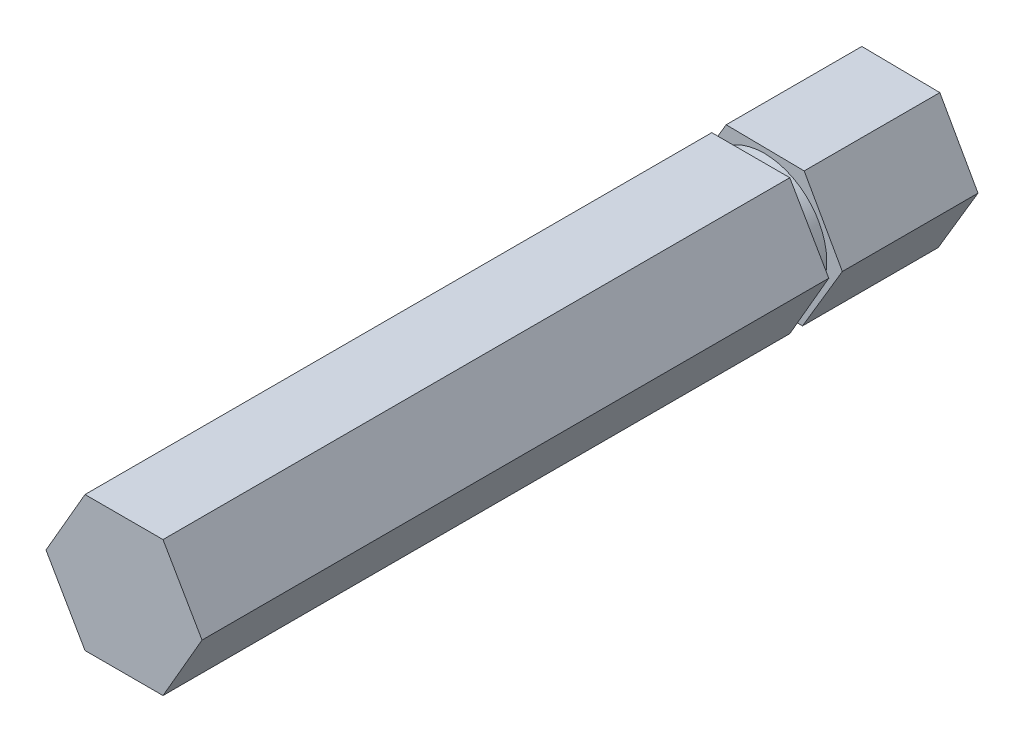
ISO-10303-21;
HEADER;
FILE_DESCRIPTION(('STEP AP214'),'2;1');
FILE_NAME('part.step','',(''),(''),'','','');
FILE_SCHEMA(('AUTOMOTIVE_DESIGN { 1 0 10303 214 1 1 1 1 }'));
ENDSEC;
DATA;
#1=APPLICATION_CONTEXT('core data for automotive mechanical design processes');
#2=APPLICATION_PROTOCOL_DEFINITION('international standard','automotive_design',2000,#1);
#3=PRODUCT_CONTEXT('',#1,'mechanical');
#4=PRODUCT('Part','Part','',(#3));
#5=PRODUCT_RELATED_PRODUCT_CATEGORY('part','',(#4));
#6=PRODUCT_DEFINITION_FORMATION('','',#4);
#7=PRODUCT_DEFINITION_CONTEXT('part definition',#1,'design');
#8=PRODUCT_DEFINITION('design','',#6,#7);
#9=PRODUCT_DEFINITION_SHAPE('','',#8);
#10=(LENGTH_UNIT() NAMED_UNIT(*) SI_UNIT(.MILLI.,.METRE.));
#11=(NAMED_UNIT(*) PLANE_ANGLE_UNIT() SI_UNIT($,.RADIAN.));
#12=(NAMED_UNIT(*) SI_UNIT($,.STERADIAN.) SOLID_ANGLE_UNIT());
#13=UNCERTAINTY_MEASURE_WITH_UNIT(LENGTH_MEASURE(1.E-05),#10,'distance_accuracy_value','');
#14=(GEOMETRIC_REPRESENTATION_CONTEXT(3) GLOBAL_UNCERTAINTY_ASSIGNED_CONTEXT((#13)) GLOBAL_UNIT_ASSIGNED_CONTEXT((#10,
#11,#12)) REPRESENTATION_CONTEXT('',''));
#15=CARTESIAN_POINT('',(0.,0.,0.));
#16=DIRECTION('',(0.,0.,1.));
#17=DIRECTION('',(1.,0.,0.));
#18=AXIS2_PLACEMENT_3D('',#15,#16,#17);
#19=CARTESIAN_POINT('',(3.65125,-6.32415051113586,29.337));
#20=DIRECTION('',(-0.866025403784439,0.5,0.));
#21=DIRECTION('',(-0.5,-0.866025403784439,0.));
#22=AXIS2_PLACEMENT_3D('',#19,#20,#21);
#23=PLANE('',#22);
#24=DIRECTION('',(0.5,0.866025403784439,0.));
#25=VECTOR('',#24,1.);
#26=CARTESIAN_POINT('',(3.65125,-6.32415051113586,-29.337));
#27=LINE('',#26,#25);
#28=CARTESIAN_POINT('',(3.65125,-6.32415051113586,-29.337));
#29=VERTEX_POINT('',#28);
#30=CARTESIAN_POINT('',(7.3025,0.,-29.337));
#31=VERTEX_POINT('',#30);
#32=EDGE_CURVE('E122',#29,#31,#27,.T.);
#33=ORIENTED_EDGE('',*,*,#32,.T.);
#34=DIRECTION('',(0.,0.,-1.));
#35=VECTOR('',#34,1.);
#36=CARTESIAN_POINT('',(7.3025,0.,29.337));
#37=LINE('',#36,#35);
#38=CARTESIAN_POINT('',(7.3025,0.,29.337));
#39=VERTEX_POINT('',#38);
#40=EDGE_CURVE('E41',#39,#31,#37,.T.);
#41=ORIENTED_EDGE('',*,*,#40,.F.);
#42=DIRECTION('',(0.5,0.866025403784439,0.));
#43=VECTOR('',#42,1.);
#44=CARTESIAN_POINT('',(3.65125,-6.32415051113586,29.337));
#45=LINE('',#44,#43);
#46=CARTESIAN_POINT('',(3.65125,-6.32415051113586,29.337));
#47=VERTEX_POINT('',#46);
#48=EDGE_CURVE('E133',#47,#39,#45,.T.);
#49=ORIENTED_EDGE('',*,*,#48,.F.);
#50=DIRECTION('',(0.,0.,-1.));
#51=VECTOR('',#50,1.);
#52=CARTESIAN_POINT('',(3.65125,-6.32415051113586,29.337));
#53=LINE('',#52,#51);
#54=EDGE_CURVE('E118',#47,#29,#53,.T.);
#55=ORIENTED_EDGE('',*,*,#54,.T.);
#56=EDGE_LOOP('',(#33,#41,#49,#55));
#57=FACE_BOUND('',#56,.T.);
#58=ADVANCED_FACE('F33',(#57),#23,.F.);
#59=CARTESIAN_POINT('',(7.3025,0.,29.337));
#60=DIRECTION('',(-0.866025403784439,-0.5,0.));
#61=DIRECTION('',(0.5,-0.866025403784439,0.));
#62=AXIS2_PLACEMENT_3D('',#59,#60,#61);
#63=PLANE('',#62);
#64=DIRECTION('',(-0.5,0.866025403784439,0.));
#65=VECTOR('',#64,1.);
#66=CARTESIAN_POINT('',(7.3025,0.,-29.337));
#67=LINE('',#66,#65);
#68=CARTESIAN_POINT('',(3.65125,6.32415051113586,-29.337));
#69=VERTEX_POINT('',#68);
#70=EDGE_CURVE('E125',#31,#69,#67,.T.);
#71=ORIENTED_EDGE('',*,*,#70,.T.);
#72=DIRECTION('',(0.,0.,-1.));
#73=VECTOR('',#72,1.);
#74=CARTESIAN_POINT('',(3.65125,6.32415051113586,29.337));
#75=LINE('',#74,#73);
#76=CARTESIAN_POINT('',(3.65125,6.32415051113586,29.337));
#77=VERTEX_POINT('',#76);
#78=EDGE_CURVE('E137',#77,#69,#75,.T.);
#79=ORIENTED_EDGE('',*,*,#78,.F.);
#80=DIRECTION('',(-0.5,0.866025403784439,0.));
#81=VECTOR('',#80,1.);
#82=CARTESIAN_POINT('',(7.3025,0.,29.337));
#83=LINE('',#82,#81);
#84=EDGE_CURVE('E88',#39,#77,#83,.T.);
#85=ORIENTED_EDGE('',*,*,#84,.F.);
#86=ORIENTED_EDGE('',*,*,#40,.T.);
#87=EDGE_LOOP('',(#71,#79,#85,#86));
#88=FACE_BOUND('',#87,.T.);
#89=ADVANCED_FACE('F140',(#88),#63,.F.);
#90=CARTESIAN_POINT('',(3.65125,6.32415051113586,29.337));
#91=DIRECTION('',(0.,-1.,0.));
#92=DIRECTION('',(0.,0.,-1.));
#93=AXIS2_PLACEMENT_3D('',#90,#91,#92);
#94=PLANE('',#93);
#95=DIRECTION('',(-1.,0.,0.));
#96=VECTOR('',#95,1.);
#97=CARTESIAN_POINT('',(3.65125,6.32415051113586,-29.337));
#98=LINE('',#97,#96);
#99=CARTESIAN_POINT('',(-3.65125,6.32415051113586,-29.337));
#100=VERTEX_POINT('',#99);
#101=EDGE_CURVE('E128',#69,#100,#98,.T.);
#102=ORIENTED_EDGE('',*,*,#101,.T.);
#103=DIRECTION('',(0.,0.,-1.));
#104=VECTOR('',#103,1.);
#105=CARTESIAN_POINT('',(-3.65125,6.32415051113586,29.337));
#106=LINE('',#105,#104);
#107=CARTESIAN_POINT('',(-3.65125,6.32415051113586,29.337));
#108=VERTEX_POINT('',#107);
#109=EDGE_CURVE('E113',#108,#100,#106,.T.);
#110=ORIENTED_EDGE('',*,*,#109,.F.);
#111=DIRECTION('',(-1.,0.,0.));
#112=VECTOR('',#111,1.);
#113=CARTESIAN_POINT('',(3.65125,6.32415051113586,29.337));
#114=LINE('',#113,#112);
#115=EDGE_CURVE('E104',#77,#108,#114,.T.);
#116=ORIENTED_EDGE('',*,*,#115,.F.);
#117=ORIENTED_EDGE('',*,*,#78,.T.);
#118=EDGE_LOOP('',(#102,#110,#116,#117));
#119=FACE_BOUND('',#118,.T.);
#120=ADVANCED_FACE('F148',(#119),#94,.F.);
#121=CARTESIAN_POINT('',(-3.65125,6.32415051113586,29.337));
#122=DIRECTION('',(0.866025403784439,-0.5,0.));
#123=DIRECTION('',(0.5,0.866025403784439,0.));
#124=AXIS2_PLACEMENT_3D('',#121,#122,#123);
#125=PLANE('',#124);
#126=DIRECTION('',(-0.5,-0.866025403784439,0.));
#127=VECTOR('',#126,1.);
#128=CARTESIAN_POINT('',(-3.65125,6.32415051113586,-29.337));
#129=LINE('',#128,#127);
#130=CARTESIAN_POINT('',(-7.3025,0.,-29.337));
#131=VERTEX_POINT('',#130);
#132=EDGE_CURVE('E112',#100,#131,#129,.T.);
#133=ORIENTED_EDGE('',*,*,#132,.T.);
#134=DIRECTION('',(0.,0.,-1.));
#135=VECTOR('',#134,1.);
#136=CARTESIAN_POINT('',(-7.3025,0.,29.337));
#137=LINE('',#136,#135);
#138=CARTESIAN_POINT('',(-7.3025,0.,29.337));
#139=VERTEX_POINT('',#138);
#140=EDGE_CURVE('E109',#139,#131,#137,.T.);
#141=ORIENTED_EDGE('',*,*,#140,.F.);
#142=DIRECTION('',(-0.5,-0.866025403784439,0.));
#143=VECTOR('',#142,1.);
#144=CARTESIAN_POINT('',(-3.65125,6.32415051113586,29.337));
#145=LINE('',#144,#143);
#146=EDGE_CURVE('E98',#108,#139,#145,.T.);
#147=ORIENTED_EDGE('',*,*,#146,.F.);
#148=ORIENTED_EDGE('',*,*,#109,.T.);
#149=EDGE_LOOP('',(#133,#141,#147,#148));
#150=FACE_BOUND('',#149,.T.);
#151=ADVANCED_FACE('F110',(#150),#125,.F.);
#152=CARTESIAN_POINT('',(-7.3025,0.,29.337));
#153=DIRECTION('',(0.866025403784439,0.5,0.));
#154=DIRECTION('',(-0.5,0.866025403784439,0.));
#155=AXIS2_PLACEMENT_3D('',#152,#153,#154);
#156=PLANE('',#155);
#157=DIRECTION('',(0.5,-0.866025403784439,0.));
#158=VECTOR('',#157,1.);
#159=CARTESIAN_POINT('',(-7.3025,0.,-29.337));
#160=LINE('',#159,#158);
#161=CARTESIAN_POINT('',(-3.65125,-6.32415051113586,-29.337));
#162=VERTEX_POINT('',#161);
#163=EDGE_CURVE('E73',#131,#162,#160,.T.);
#164=ORIENTED_EDGE('',*,*,#163,.T.);
#165=DIRECTION('',(0.,0.,-1.));
#166=VECTOR('',#165,1.);
#167=CARTESIAN_POINT('',(-3.65125,-6.32415051113586,29.337));
#168=LINE('',#167,#166);
#169=CARTESIAN_POINT('',(-3.65125,-6.32415051113586,29.337));
#170=VERTEX_POINT('',#169);
#171=EDGE_CURVE('E114',#170,#162,#168,.T.);
#172=ORIENTED_EDGE('',*,*,#171,.F.);
#173=DIRECTION('',(0.5,-0.866025403784439,0.));
#174=VECTOR('',#173,1.);
#175=CARTESIAN_POINT('',(-7.3025,0.,29.337));
#176=LINE('',#175,#174);
#177=EDGE_CURVE('E102',#139,#170,#176,.T.);
#178=ORIENTED_EDGE('',*,*,#177,.F.);
#179=ORIENTED_EDGE('',*,*,#140,.T.);
#180=EDGE_LOOP('',(#164,#172,#178,#179));
#181=FACE_BOUND('',#180,.T.);
#182=ADVANCED_FACE('F116',(#181),#156,.F.);
#183=CARTESIAN_POINT('',(-3.65125,-6.32415051113586,29.337));
#184=DIRECTION('',(0.,1.,0.));
#185=DIRECTION('',(-1.,0.,0.));
#186=AXIS2_PLACEMENT_3D('',#183,#184,#185);
#187=PLANE('',#186);
#188=DIRECTION('',(1.,0.,0.));
#189=VECTOR('',#188,1.);
#190=CARTESIAN_POINT('',(-3.65125,-6.32415051113586,-29.337));
#191=LINE('',#190,#189);
#192=EDGE_CURVE('E79',#162,#29,#191,.T.);
#193=ORIENTED_EDGE('',*,*,#192,.T.);
#194=ORIENTED_EDGE('',*,*,#54,.F.);
#195=DIRECTION('',(1.,0.,0.));
#196=VECTOR('',#195,1.);
#197=CARTESIAN_POINT('',(-3.65125,-6.32415051113586,29.337));
#198=LINE('',#197,#196);
#199=EDGE_CURVE('E49',#170,#47,#198,.T.);
#200=ORIENTED_EDGE('',*,*,#199,.F.);
#201=ORIENTED_EDGE('',*,*,#171,.T.);
#202=EDGE_LOOP('',(#193,#194,#200,#201));
#203=FACE_BOUND('',#202,.T.);
#204=ADVANCED_FACE('F265',(#203),#187,.F.);
#205=CARTESIAN_POINT('',(0.,0.,29.337));
#206=DIRECTION('',(0.,0.,1.));
#207=DIRECTION('',(1.,0.,0.));
#208=AXIS2_PLACEMENT_3D('',#205,#206,#207);
#209=PLANE('',#208);
#210=ORIENTED_EDGE('',*,*,#48,.T.);
#211=ORIENTED_EDGE('',*,*,#84,.T.);
#212=ORIENTED_EDGE('',*,*,#115,.T.);
#213=ORIENTED_EDGE('',*,*,#146,.T.);
#214=ORIENTED_EDGE('',*,*,#177,.T.);
#215=ORIENTED_EDGE('',*,*,#199,.T.);
#216=EDGE_LOOP('',(#210,#211,#212,#213,#214,#215));
#217=FACE_BOUND('',#216,.T.);
#218=ADVANCED_FACE('F100',(#217),#209,.T.);
#219=CARTESIAN_POINT('',(0.,0.,-29.337));
#220=DIRECTION('',(0.,0.,1.));
#221=DIRECTION('',(1.,0.,0.));
#222=AXIS2_PLACEMENT_3D('',#219,#220,#221);
#223=PLANE('',#222);
#224=CARTESIAN_POINT('',(0.,0.,-29.337));
#225=DIRECTION('',(0.,0.,1.));
#226=DIRECTION('',(1.,0.,0.));
#227=AXIS2_PLACEMENT_3D('',#224,#225,#226);
#228=CIRCLE('',#227,5.842);
#229=CARTESIAN_POINT('',(5.842,0.,-29.337));
#230=VERTEX_POINT('',#229);
#231=EDGE_CURVE('E11',#230,#230,#228,.F.);
#232=ORIENTED_EDGE('',*,*,#231,.F.);
#233=EDGE_LOOP('',(#232));
#234=FACE_BOUND('',#233,.T.);
#235=ORIENTED_EDGE('',*,*,#32,.F.);
#236=ORIENTED_EDGE('',*,*,#192,.F.);
#237=ORIENTED_EDGE('',*,*,#163,.F.);
#238=ORIENTED_EDGE('',*,*,#132,.F.);
#239=ORIENTED_EDGE('',*,*,#101,.F.);
#240=ORIENTED_EDGE('',*,*,#70,.F.);
#241=EDGE_LOOP('',(#235,#236,#237,#238,#239,#240));
#242=FACE_BOUND('',#241,.T.);
#243=ADVANCED_FACE('F145',(#234,#242),#223,.F.);
#244=CARTESIAN_POINT('',(0.,0.,-30.607));
#245=DIRECTION('',(0.,0.,1.));
#246=DIRECTION('',(1.,0.,0.));
#247=AXIS2_PLACEMENT_3D('',#244,#245,#246);
#248=CYLINDRICAL_SURFACE('',#247,5.842);
#249=CARTESIAN_POINT('',(0.,0.,-30.607));
#250=DIRECTION('',(0.,0.,-1.));
#251=DIRECTION('',(-1.,0.,0.));
#252=AXIS2_PLACEMENT_3D('',#249,#250,#251);
#253=CIRCLE('',#252,5.842);
#254=CARTESIAN_POINT('',(-5.842,0.,-30.607));
#255=VERTEX_POINT('',#254);
#256=EDGE_CURVE('E126',#255,#255,#253,.T.);
#257=ORIENTED_EDGE('',*,*,#256,.F.);
#258=EDGE_LOOP('',(#257));
#259=FACE_BOUND('',#258,.T.);
#260=ORIENTED_EDGE('',*,*,#231,.T.);
#261=EDGE_LOOP('',(#260));
#262=FACE_BOUND('',#261,.T.);
#263=ADVANCED_FACE('F270',(#259,#262),#248,.T.);
#264=CARTESIAN_POINT('',(3.5723825570693,-6.36903360926497,-43.307));
#265=DIRECTION('',(0.0124262592501265,0.999922791059914,0.));
#266=DIRECTION('',(-0.999922791059914,0.0124262592501265,0.));
#267=AXIS2_PLACEMENT_3D('',#264,#265,#266);
#268=PLANE('',#267);
#269=DIRECTION('',(-0.999922791059914,0.0124262592501265,0.));
#270=VECTOR('',#269,1.);
#271=CARTESIAN_POINT('',(3.5723825570693,-6.36903360926497,-30.607));
#272=LINE('',#271,#270);
#273=CARTESIAN_POINT('',(3.5723825570693,-6.36903360926497,-30.607));
#274=VERTEX_POINT('',#273);
#275=CARTESIAN_POINT('',(-3.7295536246457,-6.27829085109092,-30.607));
#276=VERTEX_POINT('',#275);
#277=EDGE_CURVE('E189',#274,#276,#272,.T.);
#278=ORIENTED_EDGE('',*,*,#277,.T.);
#279=DIRECTION('',(0.,0.,1.));
#280=VECTOR('',#279,1.);
#281=CARTESIAN_POINT('',(-3.7295536246457,-6.27829085109092,-43.307));
#282=LINE('',#281,#280);
#283=CARTESIAN_POINT('',(-3.7295536246457,-6.27829085109092,-43.307));
#284=VERTEX_POINT('',#283);
#285=EDGE_CURVE('E154',#284,#276,#282,.T.);
#286=ORIENTED_EDGE('',*,*,#285,.F.);
#287=DIRECTION('',(-0.999922791059914,0.0124262592501265,0.));
#288=VECTOR('',#287,1.);
#289=CARTESIAN_POINT('',(3.5723825570693,-6.36903360926497,-43.307));
#290=LINE('',#289,#288);
#291=CARTESIAN_POINT('',(3.5723825570693,-6.36903360926497,-43.307));
#292=VERTEX_POINT('',#291);
#293=EDGE_CURVE('E176',#292,#284,#290,.T.);
#294=ORIENTED_EDGE('',*,*,#293,.F.);
#295=DIRECTION('',(0.,0.,1.));
#296=VECTOR('',#295,1.);
#297=CARTESIAN_POINT('',(3.5723825570693,-6.36903360926497,-43.307));
#298=LINE('',#297,#296);
#299=EDGE_CURVE('E169',#292,#274,#298,.T.);
#300=ORIENTED_EDGE('',*,*,#299,.T.);
#301=EDGE_LOOP('',(#278,#286,#294,#300));
#302=FACE_BOUND('',#301,.T.);
#303=ADVANCED_FACE('F219',(#302),#268,.F.);
#304=CARTESIAN_POINT('',(-3.7295536246457,-6.27829085109092,-43.307));
#305=DIRECTION('',(0.872171668505988,0.489199939345336,0.));
#306=DIRECTION('',(-0.489199939345336,0.872171668505988,0.));
#307=AXIS2_PLACEMENT_3D('',#304,#305,#306);
#308=PLANE('',#307);
#309=DIRECTION('',(-0.489199939345336,0.872171668505988,0.));
#310=VECTOR('',#309,1.);
#311=CARTESIAN_POINT('',(-3.7295536246457,-6.27829085109092,-30.607));
#312=LINE('',#311,#310);
#313=CARTESIAN_POINT('',(-7.30193618171502,0.0907427581740539,-30.607));
#314=VERTEX_POINT('',#313);
#315=EDGE_CURVE('E186',#276,#314,#312,.T.);
#316=ORIENTED_EDGE('',*,*,#315,.T.);
#317=DIRECTION('',(0.,0.,1.));
#318=VECTOR('',#317,1.);
#319=CARTESIAN_POINT('',(-7.30193618171502,0.0907427581740539,-43.307));
#320=LINE('',#319,#318);
#321=CARTESIAN_POINT('',(-7.30193618171502,0.0907427581740539,-43.307));
#322=VERTEX_POINT('',#321);
#323=EDGE_CURVE('E157',#322,#314,#320,.T.);
#324=ORIENTED_EDGE('',*,*,#323,.F.);
#325=DIRECTION('',(-0.489199939345336,0.872171668505988,0.));
#326=VECTOR('',#325,1.);
#327=CARTESIAN_POINT('',(-3.7295536246457,-6.27829085109092,-43.307));
#328=LINE('',#327,#326);
#329=EDGE_CURVE('E203',#284,#322,#328,.T.);
#330=ORIENTED_EDGE('',*,*,#329,.F.);
#331=ORIENTED_EDGE('',*,*,#285,.T.);
#332=EDGE_LOOP('',(#316,#324,#330,#331));
#333=FACE_BOUND('',#332,.T.);
#334=ADVANCED_FACE('F223',(#333),#308,.F.);
#335=CARTESIAN_POINT('',(-7.30193618171502,0.0907427581740539,-43.307));
#336=DIRECTION('',(0.859745409255861,-0.510722851714579,0.));
#337=DIRECTION('',(0.510722851714579,0.859745409255861,0.));
#338=AXIS2_PLACEMENT_3D('',#335,#336,#337);
#339=PLANE('',#338);
#340=DIRECTION('',(0.510722851714579,0.859745409255861,0.));
#341=VECTOR('',#340,1.);
#342=CARTESIAN_POINT('',(-7.30193618171502,0.0907427581740539,-30.607));
#343=LINE('',#342,#341);
#344=CARTESIAN_POINT('',(-3.57238255706931,6.36903360926497,-30.607));
#345=VERTEX_POINT('',#344);
#346=EDGE_CURVE('E183',#314,#345,#343,.T.);
#347=ORIENTED_EDGE('',*,*,#346,.T.);
#348=DIRECTION('',(0.,0.,1.));
#349=VECTOR('',#348,1.);
#350=CARTESIAN_POINT('',(-3.57238255706931,6.36903360926497,-43.307));
#351=LINE('',#350,#349);
#352=CARTESIAN_POINT('',(-3.57238255706931,6.36903360926497,-43.307));
#353=VERTEX_POINT('',#352);
#354=EDGE_CURVE('E160',#353,#345,#351,.T.);
#355=ORIENTED_EDGE('',*,*,#354,.F.);
#356=DIRECTION('',(0.510722851714579,0.859745409255861,0.));
#357=VECTOR('',#356,1.);
#358=CARTESIAN_POINT('',(-7.30193618171502,0.0907427581740539,-43.307));
#359=LINE('',#358,#357);
#360=EDGE_CURVE('E200',#322,#353,#359,.T.);
#361=ORIENTED_EDGE('',*,*,#360,.F.);
#362=ORIENTED_EDGE('',*,*,#323,.T.);
#363=EDGE_LOOP('',(#347,#355,#361,#362));
#364=FACE_BOUND('',#363,.T.);
#365=ADVANCED_FACE('F281',(#364),#339,.F.);
#366=CARTESIAN_POINT('',(-3.57238255706931,6.36903360926497,-43.307));
#367=DIRECTION('',(-0.0124262592501266,-0.999922791059914,0.));
#368=DIRECTION('',(0.999922791059914,-0.0124262592501266,0.));
#369=AXIS2_PLACEMENT_3D('',#366,#367,#368);
#370=PLANE('',#369);
#371=DIRECTION('',(0.999922791059914,-0.0124262592501266,0.));
#372=VECTOR('',#371,1.);
#373=CARTESIAN_POINT('',(-3.57238255706931,6.36903360926497,-30.607));
#374=LINE('',#373,#372);
#375=CARTESIAN_POINT('',(3.7295536246457,6.27829085109092,-30.607));
#376=VERTEX_POINT('',#375);
#377=EDGE_CURVE('E180',#345,#376,#374,.T.);
#378=ORIENTED_EDGE('',*,*,#377,.T.);
#379=DIRECTION('',(0.,0.,1.));
#380=VECTOR('',#379,1.);
#381=CARTESIAN_POINT('',(3.7295536246457,6.27829085109092,-43.307));
#382=LINE('',#381,#380);
#383=CARTESIAN_POINT('',(3.7295536246457,6.27829085109092,-43.307));
#384=VERTEX_POINT('',#383);
#385=EDGE_CURVE('E163',#384,#376,#382,.T.);
#386=ORIENTED_EDGE('',*,*,#385,.F.);
#387=DIRECTION('',(0.999922791059914,-0.0124262592501266,0.));
#388=VECTOR('',#387,1.);
#389=CARTESIAN_POINT('',(-3.57238255706931,6.36903360926497,-43.307));
#390=LINE('',#389,#388);
#391=EDGE_CURVE('E197',#353,#384,#390,.T.);
#392=ORIENTED_EDGE('',*,*,#391,.F.);
#393=ORIENTED_EDGE('',*,*,#354,.T.);
#394=EDGE_LOOP('',(#378,#386,#392,#393));
#395=FACE_BOUND('',#394,.T.);
#396=ADVANCED_FACE('F284',(#395),#370,.F.);
#397=CARTESIAN_POINT('',(3.7295536246457,6.27829085109092,-43.307));
#398=DIRECTION('',(-0.872171668505989,-0.489199939345336,0.));
#399=DIRECTION('',(0.489199939345336,-0.872171668505989,0.));
#400=AXIS2_PLACEMENT_3D('',#397,#398,#399);
#401=PLANE('',#400);
#402=DIRECTION('',(0.489199939345336,-0.872171668505988,0.));
#403=VECTOR('',#402,1.);
#404=CARTESIAN_POINT('',(3.7295536246457,6.27829085109092,-30.607));
#405=LINE('',#404,#403);
#406=CARTESIAN_POINT('',(7.30193618171501,-0.0907427581740526,-30.607));
#407=VERTEX_POINT('',#406);
#408=EDGE_CURVE('E177',#376,#407,#405,.T.);
#409=ORIENTED_EDGE('',*,*,#408,.T.);
#410=DIRECTION('',(0.,0.,1.));
#411=VECTOR('',#410,1.);
#412=CARTESIAN_POINT('',(7.30193618171501,-0.0907427581740526,-43.307));
#413=LINE('',#412,#411);
#414=CARTESIAN_POINT('',(7.30193618171501,-0.0907427581740526,-43.307));
#415=VERTEX_POINT('',#414);
#416=EDGE_CURVE('E166',#415,#407,#413,.T.);
#417=ORIENTED_EDGE('',*,*,#416,.F.);
#418=DIRECTION('',(0.489199939345336,-0.872171668505988,0.));
#419=VECTOR('',#418,1.);
#420=CARTESIAN_POINT('',(3.7295536246457,6.27829085109092,-43.307));
#421=LINE('',#420,#419);
#422=EDGE_CURVE('E194',#384,#415,#421,.T.);
#423=ORIENTED_EDGE('',*,*,#422,.F.);
#424=ORIENTED_EDGE('',*,*,#385,.T.);
#425=EDGE_LOOP('',(#409,#417,#423,#424));
#426=FACE_BOUND('',#425,.T.);
#427=ADVANCED_FACE('F288',(#426),#401,.F.);
#428=CARTESIAN_POINT('',(7.30193618171501,-0.0907427581740526,-43.307));
#429=DIRECTION('',(-0.859745409255861,0.510722851714579,0.));
#430=DIRECTION('',(-0.510722851714579,-0.859745409255862,0.));
#431=AXIS2_PLACEMENT_3D('',#428,#429,#430);
#432=PLANE('',#431);
#433=DIRECTION('',(-0.510722851714579,-0.859745409255861,0.));
#434=VECTOR('',#433,1.);
#435=CARTESIAN_POINT('',(7.30193618171501,-0.0907427581740526,-30.607));
#436=LINE('',#435,#434);
#437=EDGE_CURVE('E173',#407,#274,#436,.T.);
#438=ORIENTED_EDGE('',*,*,#437,.T.);
#439=ORIENTED_EDGE('',*,*,#299,.F.);
#440=DIRECTION('',(-0.510722851714579,-0.859745409255861,0.));
#441=VECTOR('',#440,1.);
#442=CARTESIAN_POINT('',(7.30193618171501,-0.0907427581740526,-43.307));
#443=LINE('',#442,#441);
#444=EDGE_CURVE('E172',#415,#292,#443,.T.);
#445=ORIENTED_EDGE('',*,*,#444,.F.);
#446=ORIENTED_EDGE('',*,*,#416,.T.);
#447=EDGE_LOOP('',(#438,#439,#445,#446));
#448=FACE_BOUND('',#447,.T.);
#449=ADVANCED_FACE('F242',(#448),#432,.F.);
#450=CARTESIAN_POINT('',(0.,0.,-43.307));
#451=DIRECTION('',(0.,0.,-1.));
#452=DIRECTION('',(-1.,0.,0.));
#453=AXIS2_PLACEMENT_3D('',#450,#451,#452);
#454=PLANE('',#453);
#455=ORIENTED_EDGE('',*,*,#293,.T.);
#456=ORIENTED_EDGE('',*,*,#329,.T.);
#457=ORIENTED_EDGE('',*,*,#360,.T.);
#458=ORIENTED_EDGE('',*,*,#391,.T.);
#459=ORIENTED_EDGE('',*,*,#422,.T.);
#460=ORIENTED_EDGE('',*,*,#444,.T.);
#461=EDGE_LOOP('',(#455,#456,#457,#458,#459,#460));
#462=FACE_BOUND('',#461,.T.);
#463=ADVANCED_FACE('F211',(#462),#454,.T.);
#464=CARTESIAN_POINT('',(0.,0.,-30.607));
#465=DIRECTION('',(0.,0.,-1.));
#466=DIRECTION('',(-1.,0.,0.));
#467=AXIS2_PLACEMENT_3D('',#464,#465,#466);
#468=PLANE('',#467);
#469=ORIENTED_EDGE('',*,*,#256,.T.);
#470=EDGE_LOOP('',(#469));
#471=FACE_BOUND('',#470,.T.);
#472=ORIENTED_EDGE('',*,*,#277,.F.);
#473=ORIENTED_EDGE('',*,*,#437,.F.);
#474=ORIENTED_EDGE('',*,*,#408,.F.);
#475=ORIENTED_EDGE('',*,*,#377,.F.);
#476=ORIENTED_EDGE('',*,*,#346,.F.);
#477=ORIENTED_EDGE('',*,*,#315,.F.);
#478=EDGE_LOOP('',(#472,#473,#474,#475,#476,#477));
#479=FACE_BOUND('',#478,.T.);
#480=ADVANCED_FACE('F243',(#471,#479),#468,.F.);
#481=CLOSED_SHELL('',(#58,#89,#120,#151,#182,#204,#218,#243,#263,#303,#334,#365,#396,#427,#449,
#463,#480));
#482=MANIFOLD_SOLID_BREP('B2',#481);
#483=ADVANCED_BREP_SHAPE_REPRESENTATION('',(#18,#482),#14);
#484=SHAPE_DEFINITION_REPRESENTATION(#9,#483);
ENDSEC;
END-ISO-10303-21;
